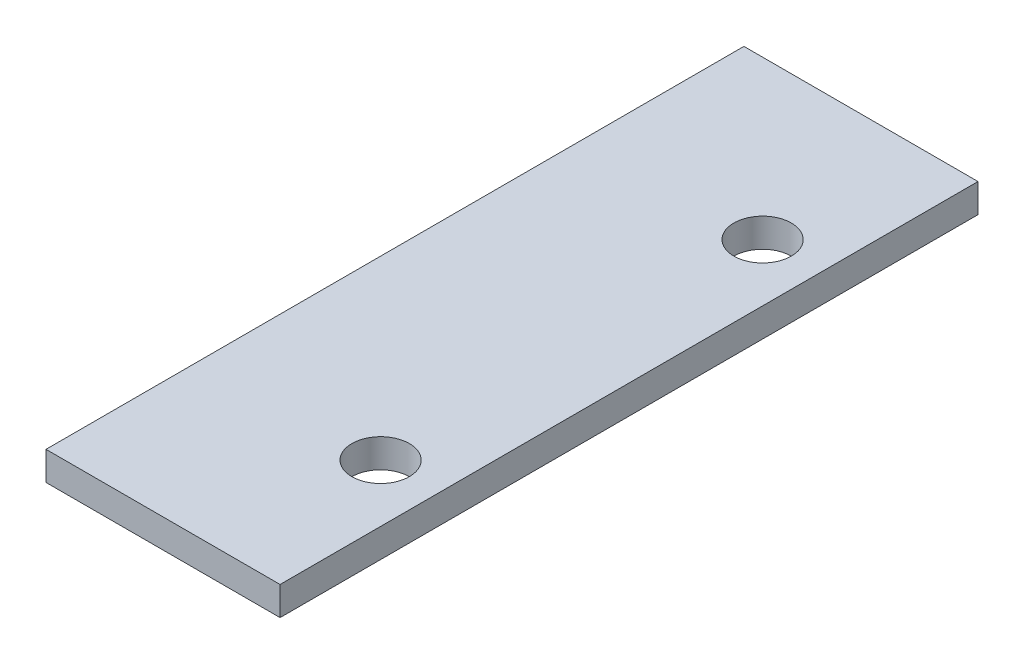
ISO-10303-21;
HEADER;
FILE_DESCRIPTION(('STEP AP214'),'2;1');
FILE_NAME('part.step','',(''),(''),'','','');
FILE_SCHEMA(('AUTOMOTIVE_DESIGN { 1 0 10303 214 1 1 1 1 }'));
ENDSEC;
DATA;
#1=APPLICATION_CONTEXT('core data for automotive mechanical design processes');
#2=APPLICATION_PROTOCOL_DEFINITION('international standard','automotive_design',2000,#1);
#3=PRODUCT_CONTEXT('',#1,'mechanical');
#4=PRODUCT('Part','Part','',(#3));
#5=PRODUCT_RELATED_PRODUCT_CATEGORY('part','',(#4));
#6=PRODUCT_DEFINITION_FORMATION('','',#4);
#7=PRODUCT_DEFINITION_CONTEXT('part definition',#1,'design');
#8=PRODUCT_DEFINITION('design','',#6,#7);
#9=PRODUCT_DEFINITION_SHAPE('','',#8);
#10=(LENGTH_UNIT() NAMED_UNIT(*) SI_UNIT(.MILLI.,.METRE.));
#11=(NAMED_UNIT(*) PLANE_ANGLE_UNIT() SI_UNIT($,.RADIAN.));
#12=(NAMED_UNIT(*) SI_UNIT($,.STERADIAN.) SOLID_ANGLE_UNIT());
#13=UNCERTAINTY_MEASURE_WITH_UNIT(LENGTH_MEASURE(1.E-05),#10,'distance_accuracy_value','');
#14=(GEOMETRIC_REPRESENTATION_CONTEXT(3) GLOBAL_UNCERTAINTY_ASSIGNED_CONTEXT((#13)) GLOBAL_UNIT_ASSIGNED_CONTEXT((#10,
#11,#12)) REPRESENTATION_CONTEXT('',''));
#15=CARTESIAN_POINT('',(0.,0.,0.));
#16=DIRECTION('',(0.,0.,1.));
#17=DIRECTION('',(1.,0.,0.));
#18=AXIS2_PLACEMENT_3D('',#15,#16,#17);
#19=CARTESIAN_POINT('',(0.,2.,0.));
#20=DIRECTION('',(0.,1.,0.));
#21=DIRECTION('',(0.,0.,1.));
#22=AXIS2_PLACEMENT_3D('',#19,#20,#21);
#23=PLANE('',#22);
#24=CARTESIAN_POINT('',(-38.432619440041,2.,6.04371807047301));
#25=DIRECTION('',(0.,1.,0.));
#26=DIRECTION('',(0.,0.,1.));
#27=AXIS2_PLACEMENT_3D('',#24,#25,#26);
#28=CIRCLE('',#27,2.);
#29=CARTESIAN_POINT('',(-38.432619440041,2.,8.04371807047301));
#30=VERTEX_POINT('',#29);
#31=EDGE_CURVE('E99',#30,#30,#28,.T.);
#32=ORIENTED_EDGE('',*,*,#31,.F.);
#33=EDGE_LOOP('',(#32));
#34=FACE_BOUND('',#33,.T.);
#35=DIRECTION('',(0.,0.,1.));
#36=VECTOR('',#35,1.);
#37=CARTESIAN_POINT('',(-50.732619440041,2.,-4.95628192952699));
#38=LINE('',#37,#36);
#39=CARTESIAN_POINT('',(-50.732619440041,2.,-4.95628192952699));
#40=VERTEX_POINT('',#39);
#41=CARTESIAN_POINT('',(-50.732619440041,2.,43.643718070473));
#42=VERTEX_POINT('',#41);
#43=EDGE_CURVE('E84',#40,#42,#38,.T.);
#44=ORIENTED_EDGE('',*,*,#43,.T.);
#45=DIRECTION('',(1.,0.,0.));
#46=VECTOR('',#45,1.);
#47=CARTESIAN_POINT('',(-50.732619440041,2.,43.643718070473));
#48=LINE('',#47,#46);
#49=CARTESIAN_POINT('',(-34.432619440041,2.,43.643718070473));
#50=VERTEX_POINT('',#49);
#51=EDGE_CURVE('E79',#42,#50,#48,.T.);
#52=ORIENTED_EDGE('',*,*,#51,.T.);
#53=DIRECTION('',(0.,0.,-1.));
#54=VECTOR('',#53,1.);
#55=CARTESIAN_POINT('',(-34.4326194400411,2.,-4.95628192952699));
#56=LINE('',#55,#54);
#57=CARTESIAN_POINT('',(-34.4326194400411,2.,-4.95628192952699));
#58=VERTEX_POINT('',#57);
#59=EDGE_CURVE('E82',#50,#58,#56,.T.);
#60=ORIENTED_EDGE('',*,*,#59,.T.);
#61=DIRECTION('',(-1.,0.,0.));
#62=VECTOR('',#61,1.);
#63=CARTESIAN_POINT('',(-50.732619440041,2.,-4.95628192952699));
#64=LINE('',#63,#62);
#65=EDGE_CURVE('E49',#58,#40,#64,.T.);
#66=ORIENTED_EDGE('',*,*,#65,.T.);
#67=EDGE_LOOP('',(#44,#52,#60,#66));
#68=FACE_BOUND('',#67,.T.);
#69=CARTESIAN_POINT('',(-38.432619440041,2.,32.643718070473));
#70=DIRECTION('',(0.,1.,0.));
#71=DIRECTION('',(0.,0.,1.));
#72=AXIS2_PLACEMENT_3D('',#69,#70,#71);
#73=CIRCLE('',#72,2.);
#74=CARTESIAN_POINT('',(-38.432619440041,2.,34.643718070473));
#75=VERTEX_POINT('',#74);
#76=EDGE_CURVE('E114',#75,#75,#73,.T.);
#77=ORIENTED_EDGE('',*,*,#76,.F.);
#78=EDGE_LOOP('',(#77));
#79=FACE_BOUND('',#78,.T.);
#80=ADVANCED_FACE('F32',(#34,#68,#79),#23,.T.);
#81=CARTESIAN_POINT('',(0.,0.,0.));
#82=DIRECTION('',(0.,1.,0.));
#83=DIRECTION('',(0.,0.,1.));
#84=AXIS2_PLACEMENT_3D('',#81,#82,#83);
#85=PLANE('',#84);
#86=CARTESIAN_POINT('',(-38.432619440041,0.,6.04371807047301));
#87=DIRECTION('',(0.,1.,0.));
#88=DIRECTION('',(0.,0.,1.));
#89=AXIS2_PLACEMENT_3D('',#86,#87,#88);
#90=CIRCLE('',#89,2.);
#91=CARTESIAN_POINT('',(-38.432619440041,0.,8.04371807047301));
#92=VERTEX_POINT('',#91);
#93=EDGE_CURVE('E111',#92,#92,#90,.T.);
#94=ORIENTED_EDGE('',*,*,#93,.T.);
#95=EDGE_LOOP('',(#94));
#96=FACE_BOUND('',#95,.T.);
#97=DIRECTION('',(0.,0.,1.));
#98=VECTOR('',#97,1.);
#99=CARTESIAN_POINT('',(-50.732619440041,0.,-4.95628192952699));
#100=LINE('',#99,#98);
#101=CARTESIAN_POINT('',(-50.732619440041,0.,-4.95628192952699));
#102=VERTEX_POINT('',#101);
#103=CARTESIAN_POINT('',(-50.732619440041,0.,43.643718070473));
#104=VERTEX_POINT('',#103);
#105=EDGE_CURVE('E96',#102,#104,#100,.T.);
#106=ORIENTED_EDGE('',*,*,#105,.F.);
#107=DIRECTION('',(-1.,0.,0.));
#108=VECTOR('',#107,1.);
#109=CARTESIAN_POINT('',(-50.732619440041,0.,-4.95628192952699));
#110=LINE('',#109,#108);
#111=CARTESIAN_POINT('',(-34.4326194400411,0.,-4.95628192952699));
#112=VERTEX_POINT('',#111);
#113=EDGE_CURVE('E72',#112,#102,#110,.T.);
#114=ORIENTED_EDGE('',*,*,#113,.F.);
#115=DIRECTION('',(0.,0.,-1.));
#116=VECTOR('',#115,1.);
#117=CARTESIAN_POINT('',(-34.4326194400411,0.,-4.95628192952699));
#118=LINE('',#117,#116);
#119=CARTESIAN_POINT('',(-34.432619440041,0.,43.643718070473));
#120=VERTEX_POINT('',#119);
#121=EDGE_CURVE('E66',#120,#112,#118,.T.);
#122=ORIENTED_EDGE('',*,*,#121,.F.);
#123=DIRECTION('',(1.,0.,0.));
#124=VECTOR('',#123,1.);
#125=CARTESIAN_POINT('',(-50.732619440041,0.,43.643718070473));
#126=LINE('',#125,#124);
#127=EDGE_CURVE('E88',#104,#120,#126,.T.);
#128=ORIENTED_EDGE('',*,*,#127,.F.);
#129=EDGE_LOOP('',(#106,#114,#122,#128));
#130=FACE_BOUND('',#129,.T.);
#131=CARTESIAN_POINT('',(-38.432619440041,0.,32.643718070473));
#132=DIRECTION('',(0.,1.,0.));
#133=DIRECTION('',(0.,0.,1.));
#134=AXIS2_PLACEMENT_3D('',#131,#132,#133);
#135=CIRCLE('',#134,2.);
#136=CARTESIAN_POINT('',(-38.432619440041,0.,34.643718070473));
#137=VERTEX_POINT('',#136);
#138=EDGE_CURVE('E117',#137,#137,#135,.T.);
#139=ORIENTED_EDGE('',*,*,#138,.T.);
#140=EDGE_LOOP('',(#139));
#141=FACE_BOUND('',#140,.T.);
#142=ADVANCED_FACE('F107',(#96,#130,#141),#85,.F.);
#143=CARTESIAN_POINT('',(-50.732619440041,2.,-4.95628192952699));
#144=DIRECTION('',(1.,0.,0.));
#145=DIRECTION('',(0.,0.,-1.));
#146=AXIS2_PLACEMENT_3D('',#143,#144,#145);
#147=PLANE('',#146);
#148=ORIENTED_EDGE('',*,*,#105,.T.);
#149=DIRECTION('',(0.,-1.,0.));
#150=VECTOR('',#149,1.);
#151=CARTESIAN_POINT('',(-50.732619440041,2.,43.643718070473));
#152=LINE('',#151,#150);
#153=EDGE_CURVE('E11',#42,#104,#152,.T.);
#154=ORIENTED_EDGE('',*,*,#153,.F.);
#155=ORIENTED_EDGE('',*,*,#43,.F.);
#156=DIRECTION('',(0.,-1.,0.));
#157=VECTOR('',#156,1.);
#158=CARTESIAN_POINT('',(-50.732619440041,2.,-4.95628192952699));
#159=LINE('',#158,#157);
#160=EDGE_CURVE('E92',#40,#102,#159,.T.);
#161=ORIENTED_EDGE('',*,*,#160,.T.);
#162=EDGE_LOOP('',(#148,#154,#155,#161));
#163=FACE_BOUND('',#162,.T.);
#164=ADVANCED_FACE('F34',(#163),#147,.F.);
#165=CARTESIAN_POINT('',(-50.732619440041,2.,43.643718070473));
#166=DIRECTION('',(0.,0.,-1.));
#167=DIRECTION('',(-1.,0.,0.));
#168=AXIS2_PLACEMENT_3D('',#165,#166,#167);
#169=PLANE('',#168);
#170=ORIENTED_EDGE('',*,*,#127,.T.);
#171=DIRECTION('',(0.,-1.,0.));
#172=VECTOR('',#171,1.);
#173=CARTESIAN_POINT('',(-34.432619440041,2.,43.643718070473));
#174=LINE('',#173,#172);
#175=EDGE_CURVE('E41',#50,#120,#174,.T.);
#176=ORIENTED_EDGE('',*,*,#175,.F.);
#177=ORIENTED_EDGE('',*,*,#51,.F.);
#178=ORIENTED_EDGE('',*,*,#153,.T.);
#179=EDGE_LOOP('',(#170,#176,#177,#178));
#180=FACE_BOUND('',#179,.T.);
#181=ADVANCED_FACE('F87',(#180),#169,.F.);
#182=CARTESIAN_POINT('',(-34.4326194400411,2.,-4.95628192952699));
#183=DIRECTION('',(-1.,0.,0.));
#184=DIRECTION('',(0.,0.,1.));
#185=AXIS2_PLACEMENT_3D('',#182,#183,#184);
#186=PLANE('',#185);
#187=ORIENTED_EDGE('',*,*,#121,.T.);
#188=DIRECTION('',(0.,-1.,0.));
#189=VECTOR('',#188,1.);
#190=CARTESIAN_POINT('',(-34.4326194400411,2.,-4.95628192952699));
#191=LINE('',#190,#189);
#192=EDGE_CURVE('E89',#58,#112,#191,.T.);
#193=ORIENTED_EDGE('',*,*,#192,.F.);
#194=ORIENTED_EDGE('',*,*,#59,.F.);
#195=ORIENTED_EDGE('',*,*,#175,.T.);
#196=EDGE_LOOP('',(#187,#193,#194,#195));
#197=FACE_BOUND('',#196,.T.);
#198=ADVANCED_FACE('F90',(#197),#186,.F.);
#199=CARTESIAN_POINT('',(-50.732619440041,2.,-4.95628192952699));
#200=DIRECTION('',(0.,0.,1.));
#201=DIRECTION('',(1.,0.,0.));
#202=AXIS2_PLACEMENT_3D('',#199,#200,#201);
#203=PLANE('',#202);
#204=ORIENTED_EDGE('',*,*,#113,.T.);
#205=ORIENTED_EDGE('',*,*,#160,.F.);
#206=ORIENTED_EDGE('',*,*,#65,.F.);
#207=ORIENTED_EDGE('',*,*,#192,.T.);
#208=EDGE_LOOP('',(#204,#205,#206,#207));
#209=FACE_BOUND('',#208,.T.);
#210=ADVANCED_FACE('F104',(#209),#203,.F.);
#211=CARTESIAN_POINT('',(-38.432619440041,2.,6.04371807047301));
#212=DIRECTION('',(0.,-1.,0.));
#213=DIRECTION('',(0.,0.,-1.));
#214=AXIS2_PLACEMENT_3D('',#211,#212,#213);
#215=CYLINDRICAL_SURFACE('',#214,2.);
#216=ORIENTED_EDGE('',*,*,#31,.T.);
#217=EDGE_LOOP('',(#216));
#218=FACE_BOUND('',#217,.T.);
#219=ORIENTED_EDGE('',*,*,#93,.F.);
#220=EDGE_LOOP('',(#219));
#221=FACE_BOUND('',#220,.T.);
#222=ADVANCED_FACE('F135',(#218,#221),#215,.F.);
#223=CARTESIAN_POINT('',(-38.432619440041,2.,32.643718070473));
#224=DIRECTION('',(0.,-1.,0.));
#225=DIRECTION('',(0.,0.,-1.));
#226=AXIS2_PLACEMENT_3D('',#223,#224,#225);
#227=CYLINDRICAL_SURFACE('',#226,2.);
#228=ORIENTED_EDGE('',*,*,#76,.T.);
#229=EDGE_LOOP('',(#228));
#230=FACE_BOUND('',#229,.T.);
#231=ORIENTED_EDGE('',*,*,#138,.F.);
#232=EDGE_LOOP('',(#231));
#233=FACE_BOUND('',#232,.T.);
#234=ADVANCED_FACE('F123',(#230,#233),#227,.F.);
#235=CLOSED_SHELL('',(#80,#142,#164,#181,#198,#210,#222,#234));
#236=MANIFOLD_SOLID_BREP('B2',#235);
#237=ADVANCED_BREP_SHAPE_REPRESENTATION('',(#18,#236),#14);
#238=SHAPE_DEFINITION_REPRESENTATION(#9,#237);
ENDSEC;
END-ISO-10303-21;
